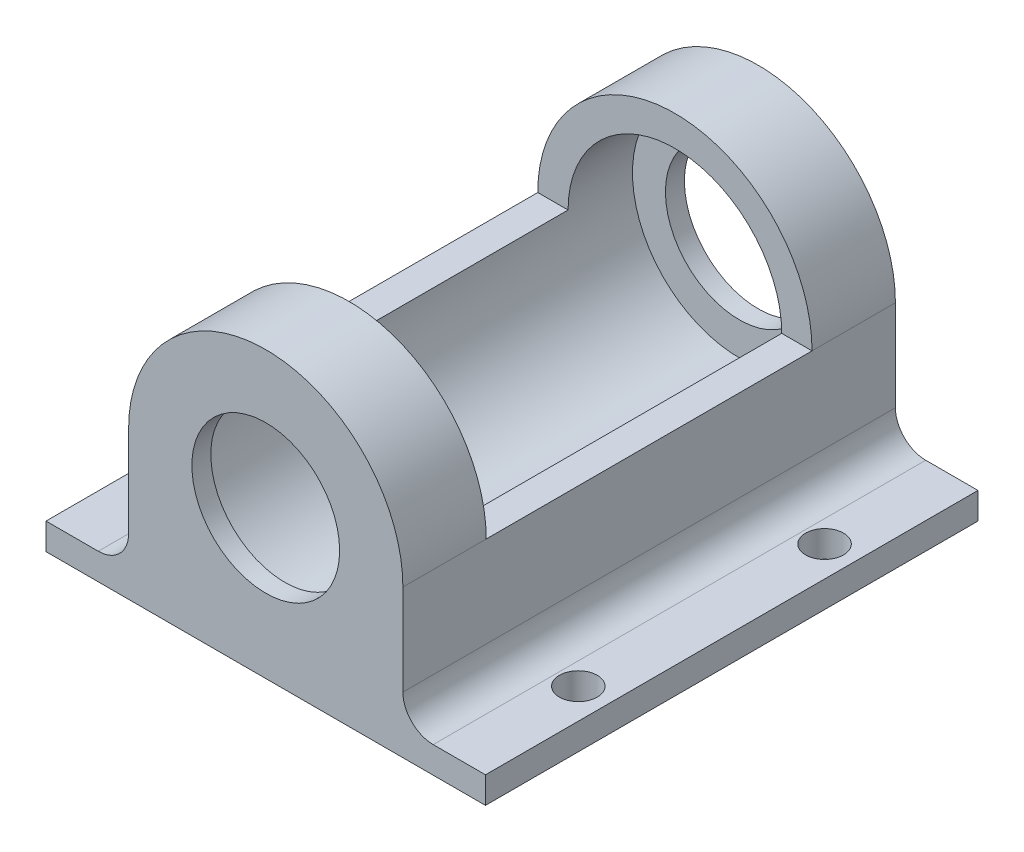
ISO-10303-21;
HEADER;
FILE_DESCRIPTION(('STEP AP214'),'2;1');
FILE_NAME('part.step','',(''),(''),'','','');
FILE_SCHEMA(('AUTOMOTIVE_DESIGN { 1 0 10303 214 1 1 1 1 }'));
ENDSEC;
DATA;
#1=APPLICATION_CONTEXT('core data for automotive mechanical design processes');
#2=APPLICATION_PROTOCOL_DEFINITION('international standard','automotive_design',2000,#1);
#3=PRODUCT_CONTEXT('',#1,'mechanical');
#4=PRODUCT('Part','Part','',(#3));
#5=PRODUCT_RELATED_PRODUCT_CATEGORY('part','',(#4));
#6=PRODUCT_DEFINITION_FORMATION('','',#4);
#7=PRODUCT_DEFINITION_CONTEXT('part definition',#1,'design');
#8=PRODUCT_DEFINITION('design','',#6,#7);
#9=PRODUCT_DEFINITION_SHAPE('','',#8);
#10=(LENGTH_UNIT() NAMED_UNIT(*) SI_UNIT(.MILLI.,.METRE.));
#11=(NAMED_UNIT(*) PLANE_ANGLE_UNIT() SI_UNIT($,.RADIAN.));
#12=(NAMED_UNIT(*) SI_UNIT($,.STERADIAN.) SOLID_ANGLE_UNIT());
#13=UNCERTAINTY_MEASURE_WITH_UNIT(LENGTH_MEASURE(1.E-05),#10,'distance_accuracy_value','');
#14=(GEOMETRIC_REPRESENTATION_CONTEXT(3) GLOBAL_UNCERTAINTY_ASSIGNED_CONTEXT((#13)) GLOBAL_UNIT_ASSIGNED_CONTEXT((#10,
#11,#12)) REPRESENTATION_CONTEXT('',''));
#15=CARTESIAN_POINT('',(0.,0.,0.));
#16=DIRECTION('',(0.,0.,1.));
#17=DIRECTION('',(1.,0.,0.));
#18=AXIS2_PLACEMENT_3D('',#15,#16,#17);
#19=CARTESIAN_POINT('',(0.,3.5,0.));
#20=DIRECTION('',(0.,-1.,0.));
#21=DIRECTION('',(0.,0.,-1.));
#22=AXIS2_PLACEMENT_3D('',#19,#20,#21);
#23=PLANE('',#22);
#24=CARTESIAN_POINT('',(25.,3.5,16.25));
#25=DIRECTION('',(0.,1.,0.));
#26=DIRECTION('',(0.,0.,1.));
#27=AXIS2_PLACEMENT_3D('',#24,#25,#26);
#28=CIRCLE('',#27,2.5);
#29=CARTESIAN_POINT('',(25.,3.5,18.75));
#30=VERTEX_POINT('',#29);
#31=EDGE_CURVE('E282',#30,#30,#28,.T.);
#32=ORIENTED_EDGE('',*,*,#31,.F.);
#33=EDGE_LOOP('',(#32));
#34=FACE_BOUND('',#33,.T.);
#35=CARTESIAN_POINT('',(25.,3.5,-16.25));
#36=DIRECTION('',(0.,1.,0.));
#37=DIRECTION('',(0.,0.,1.));
#38=AXIS2_PLACEMENT_3D('',#35,#36,#37);
#39=CIRCLE('',#38,2.5);
#40=CARTESIAN_POINT('',(25.,3.5,-13.75));
#41=VERTEX_POINT('',#40);
#42=EDGE_CURVE('E274',#41,#41,#39,.T.);
#43=ORIENTED_EDGE('',*,*,#42,.F.);
#44=EDGE_LOOP('',(#43));
#45=FACE_BOUND('',#44,.T.);
#46=DIRECTION('',(0.,0.,-1.));
#47=VECTOR('',#46,1.);
#48=CARTESIAN_POINT('',(22.1,3.5,0.));
#49=LINE('',#48,#47);
#50=CARTESIAN_POINT('',(22.1,3.5,-32.5));
#51=VERTEX_POINT('',#50);
#52=CARTESIAN_POINT('',(22.1,3.5,32.5));
#53=VERTEX_POINT('',#52);
#54=EDGE_CURVE('E355',#51,#53,#49,.F.);
#55=ORIENTED_EDGE('',*,*,#54,.T.);
#56=DIRECTION('',(1.,0.,0.));
#57=VECTOR('',#56,1.);
#58=CARTESIAN_POINT('',(-29.,3.5,32.5));
#59=LINE('',#58,#57);
#60=CARTESIAN_POINT('',(29.,3.5,32.5));
#61=VERTEX_POINT('',#60);
#62=EDGE_CURVE('E311',#53,#61,#59,.T.);
#63=ORIENTED_EDGE('',*,*,#62,.T.);
#64=DIRECTION('',(0.,0.,-1.));
#65=VECTOR('',#64,1.);
#66=CARTESIAN_POINT('',(29.,3.5,32.5));
#67=LINE('',#66,#65);
#68=CARTESIAN_POINT('',(29.,3.5,-32.5));
#69=VERTEX_POINT('',#68);
#70=EDGE_CURVE('E298',#61,#69,#67,.T.);
#71=ORIENTED_EDGE('',*,*,#70,.T.);
#72=DIRECTION('',(-1.,0.,0.));
#73=VECTOR('',#72,1.);
#74=CARTESIAN_POINT('',(-29.,3.5,-32.5));
#75=LINE('',#74,#73);
#76=EDGE_CURVE('E304',#69,#51,#75,.T.);
#77=ORIENTED_EDGE('',*,*,#76,.T.);
#78=EDGE_LOOP('',(#55,#63,#71,#77));
#79=FACE_BOUND('',#78,.T.);
#80=ADVANCED_FACE('F55',(#34,#45,#79),#23,.F.);
#81=CARTESIAN_POINT('',(0.,0.,21.5));
#82=DIRECTION('',(0.,0.,1.));
#83=DIRECTION('',(1.,0.,0.));
#84=AXIS2_PLACEMENT_3D('',#81,#82,#83);
#85=PLANE('',#84);
#86=DIRECTION('',(1.,0.,0.));
#87=VECTOR('',#86,1.);
#88=CARTESIAN_POINT('',(0.,19.5,21.5));
#89=LINE('',#88,#87);
#90=CARTESIAN_POINT('',(14.1,19.5,21.5));
#91=VERTEX_POINT('',#90);
#92=CARTESIAN_POINT('',(18.1,19.5,21.5));
#93=VERTEX_POINT('',#92);
#94=EDGE_CURVE('E76',#91,#93,#89,.T.);
#95=ORIENTED_EDGE('',*,*,#94,.F.);
#96=CARTESIAN_POINT('',(0.,19.5,21.5));
#97=DIRECTION('',(0.,0.,1.));
#98=DIRECTION('',(1.,0.,0.));
#99=AXIS2_PLACEMENT_3D('',#96,#97,#98);
#100=CIRCLE('',#99,14.1);
#101=CARTESIAN_POINT('',(-14.1,19.5,21.5));
#102=VERTEX_POINT('',#101);
#103=EDGE_CURVE('E71',#91,#102,#100,.T.);
#104=ORIENTED_EDGE('',*,*,#103,.T.);
#105=DIRECTION('',(1.,0.,0.));
#106=VECTOR('',#105,1.);
#107=CARTESIAN_POINT('',(0.,19.5,21.5));
#108=LINE('',#107,#106);
#109=CARTESIAN_POINT('',(-18.1,19.5,21.5));
#110=VERTEX_POINT('',#109);
#111=EDGE_CURVE('E210',#110,#102,#108,.T.);
#112=ORIENTED_EDGE('',*,*,#111,.F.);
#113=CARTESIAN_POINT('',(0.,19.5,21.5));
#114=DIRECTION('',(0.,0.,1.));
#115=DIRECTION('',(1.,0.,0.));
#116=AXIS2_PLACEMENT_3D('',#113,#114,#115);
#117=CIRCLE('',#116,18.1);
#118=EDGE_CURVE('E167',#110,#93,#117,.F.);
#119=ORIENTED_EDGE('',*,*,#118,.T.);
#120=EDGE_LOOP('',(#95,#104,#112,#119));
#121=FACE_BOUND('',#120,.T.);
#122=ADVANCED_FACE('F430',(#121),#85,.F.);
#123=CARTESIAN_POINT('',(0.,0.,-21.5));
#124=DIRECTION('',(0.,0.,1.));
#125=DIRECTION('',(1.,0.,0.));
#126=AXIS2_PLACEMENT_3D('',#123,#124,#125);
#127=PLANE('',#126);
#128=CARTESIAN_POINT('',(0.,19.5,-21.5));
#129=DIRECTION('',(0.,0.,1.));
#130=DIRECTION('',(1.,0.,0.));
#131=AXIS2_PLACEMENT_3D('',#128,#129,#130);
#132=CIRCLE('',#131,14.1);
#133=CARTESIAN_POINT('',(14.1,19.5,-21.5));
#134=VERTEX_POINT('',#133);
#135=CARTESIAN_POINT('',(-14.1,19.5,-21.5));
#136=VERTEX_POINT('',#135);
#137=EDGE_CURVE('E179',#134,#136,#132,.T.);
#138=ORIENTED_EDGE('',*,*,#137,.F.);
#139=DIRECTION('',(-1.,0.,0.));
#140=VECTOR('',#139,1.);
#141=CARTESIAN_POINT('',(14.1,19.5,-21.5));
#142=LINE('',#141,#140);
#143=CARTESIAN_POINT('',(18.1,19.5,-21.5));
#144=VERTEX_POINT('',#143);
#145=EDGE_CURVE('E176',#144,#134,#142,.T.);
#146=ORIENTED_EDGE('',*,*,#145,.F.);
#147=CARTESIAN_POINT('',(0.,19.5,-21.5));
#148=DIRECTION('',(0.,0.,1.));
#149=DIRECTION('',(1.,0.,0.));
#150=AXIS2_PLACEMENT_3D('',#147,#148,#149);
#151=CIRCLE('',#150,18.1);
#152=CARTESIAN_POINT('',(-18.1,19.5,-21.5));
#153=VERTEX_POINT('',#152);
#154=EDGE_CURVE('E158',#153,#144,#151,.F.);
#155=ORIENTED_EDGE('',*,*,#154,.F.);
#156=DIRECTION('',(-1.,0.,0.));
#157=VECTOR('',#156,1.);
#158=CARTESIAN_POINT('',(-18.1,19.5,-21.5));
#159=LINE('',#158,#157);
#160=EDGE_CURVE('E173',#136,#153,#159,.T.);
#161=ORIENTED_EDGE('',*,*,#160,.F.);
#162=EDGE_LOOP('',(#138,#146,#155,#161));
#163=FACE_BOUND('',#162,.T.);
#164=ADVANCED_FACE('F171',(#163),#127,.T.);
#165=CARTESIAN_POINT('',(-25.,3.5,-16.25));
#166=DIRECTION('',(0.,1.,0.));
#167=DIRECTION('',(0.,0.,1.));
#168=AXIS2_PLACEMENT_3D('',#165,#166,#167);
#169=CIRCLE('',#168,2.5);
#170=CARTESIAN_POINT('',(-25.,3.5,-13.75));
#171=VERTEX_POINT('',#170);
#172=EDGE_CURVE('E266',#171,#171,#169,.T.);
#173=ORIENTED_EDGE('',*,*,#172,.F.);
#174=EDGE_LOOP('',(#173));
#175=FACE_BOUND('',#174,.T.);
#176=CARTESIAN_POINT('',(-25.,3.5,16.25));
#177=DIRECTION('',(0.,1.,0.));
#178=DIRECTION('',(0.,0.,1.));
#179=AXIS2_PLACEMENT_3D('',#176,#177,#178);
#180=CIRCLE('',#179,2.5);
#181=CARTESIAN_POINT('',(-25.,3.5,18.75));
#182=VERTEX_POINT('',#181);
#183=EDGE_CURVE('E290',#182,#182,#180,.T.);
#184=ORIENTED_EDGE('',*,*,#183,.F.);
#185=EDGE_LOOP('',(#184));
#186=FACE_BOUND('',#185,.T.);
#187=CARTESIAN_POINT('',(-29.,3.5,32.5));
#188=VERTEX_POINT('',#187);
#189=CARTESIAN_POINT('',(-22.1,3.5,32.5));
#190=VERTEX_POINT('',#189);
#191=EDGE_CURVE('E312',#188,#190,#59,.T.);
#192=ORIENTED_EDGE('',*,*,#191,.T.);
#193=DIRECTION('',(0.,0.,-1.));
#194=VECTOR('',#193,1.);
#195=CARTESIAN_POINT('',(-22.1,3.5,-32.5));
#196=LINE('',#195,#194);
#197=CARTESIAN_POINT('',(-22.1,3.5,-32.5));
#198=VERTEX_POINT('',#197);
#199=EDGE_CURVE('E358',#190,#198,#196,.T.);
#200=ORIENTED_EDGE('',*,*,#199,.T.);
#201=CARTESIAN_POINT('',(-29.,3.5,-32.5));
#202=VERTEX_POINT('',#201);
#203=EDGE_CURVE('E302',#198,#202,#75,.T.);
#204=ORIENTED_EDGE('',*,*,#203,.T.);
#205=DIRECTION('',(0.,0.,1.));
#206=VECTOR('',#205,1.);
#207=CARTESIAN_POINT('',(-29.,3.5,32.5));
#208=LINE('',#207,#206);
#209=EDGE_CURVE('E308',#202,#188,#208,.T.);
#210=ORIENTED_EDGE('',*,*,#209,.T.);
#211=EDGE_LOOP('',(#192,#200,#204,#210));
#212=FACE_BOUND('',#211,.T.);
#213=ADVANCED_FACE('F433',(#175,#186,#212),#23,.F.);
#214=CARTESIAN_POINT('',(0.,0.,30.));
#215=DIRECTION('',(0.,0.,1.));
#216=DIRECTION('',(1.,0.,0.));
#217=AXIS2_PLACEMENT_3D('',#214,#215,#216);
#218=PLANE('',#217);
#219=CARTESIAN_POINT('',(0.,19.5,30.));
#220=DIRECTION('',(0.,0.,1.));
#221=DIRECTION('',(1.,0.,0.));
#222=AXIS2_PLACEMENT_3D('',#219,#220,#221);
#223=CIRCLE('',#222,9.75);
#224=CARTESIAN_POINT('',(9.75,19.5,30.));
#225=VERTEX_POINT('',#224);
#226=EDGE_CURVE('E240',#225,#225,#223,.T.);
#227=ORIENTED_EDGE('',*,*,#226,.T.);
#228=EDGE_LOOP('',(#227));
#229=FACE_BOUND('',#228,.T.);
#230=CARTESIAN_POINT('',(0.,19.5,30.));
#231=DIRECTION('',(0.,0.,1.));
#232=DIRECTION('',(1.,0.,0.));
#233=AXIS2_PLACEMENT_3D('',#230,#231,#232);
#234=CIRCLE('',#233,14.1);
#235=CARTESIAN_POINT('',(14.1,19.5,30.));
#236=VERTEX_POINT('',#235);
#237=EDGE_CURVE('E343',#236,#236,#234,.T.);
#238=ORIENTED_EDGE('',*,*,#237,.F.);
#239=EDGE_LOOP('',(#238));
#240=FACE_BOUND('',#239,.T.);
#241=ADVANCED_FACE('F443',(#229,#240),#218,.F.);
#242=CARTESIAN_POINT('',(0.,0.,0.));
#243=DIRECTION('',(0.,-1.,0.));
#244=DIRECTION('',(0.,0.,-1.));
#245=AXIS2_PLACEMENT_3D('',#242,#243,#244);
#246=PLANE('',#245);
#247=CARTESIAN_POINT('',(25.,0.,-16.25));
#248=DIRECTION('',(0.,1.,0.));
#249=DIRECTION('',(0.,0.,1.));
#250=AXIS2_PLACEMENT_3D('',#247,#248,#249);
#251=CIRCLE('',#250,2.5);
#252=CARTESIAN_POINT('',(25.,0.,-13.75));
#253=VERTEX_POINT('',#252);
#254=EDGE_CURVE('E270',#253,#253,#251,.T.);
#255=ORIENTED_EDGE('',*,*,#254,.T.);
#256=EDGE_LOOP('',(#255));
#257=FACE_BOUND('',#256,.T.);
#258=CARTESIAN_POINT('',(-25.,0.,16.25));
#259=DIRECTION('',(0.,1.,0.));
#260=DIRECTION('',(0.,0.,1.));
#261=AXIS2_PLACEMENT_3D('',#258,#259,#260);
#262=CIRCLE('',#261,2.5);
#263=CARTESIAN_POINT('',(-25.,0.,18.75));
#264=VERTEX_POINT('',#263);
#265=EDGE_CURVE('E286',#264,#264,#262,.T.);
#266=ORIENTED_EDGE('',*,*,#265,.T.);
#267=EDGE_LOOP('',(#266));
#268=FACE_BOUND('',#267,.T.);
#269=DIRECTION('',(0.,0.,-1.));
#270=VECTOR('',#269,1.);
#271=CARTESIAN_POINT('',(29.,0.,32.5));
#272=LINE('',#271,#270);
#273=CARTESIAN_POINT('',(29.,0.,32.5));
#274=VERTEX_POINT('',#273);
#275=CARTESIAN_POINT('',(29.,0.,-32.5));
#276=VERTEX_POINT('',#275);
#277=EDGE_CURVE('E294',#274,#276,#272,.T.);
#278=ORIENTED_EDGE('',*,*,#277,.F.);
#279=DIRECTION('',(1.,0.,0.));
#280=VECTOR('',#279,1.);
#281=CARTESIAN_POINT('',(-29.,0.,32.5));
#282=LINE('',#281,#280);
#283=CARTESIAN_POINT('',(-29.,0.,32.5));
#284=VERTEX_POINT('',#283);
#285=EDGE_CURVE('E303',#284,#274,#282,.T.);
#286=ORIENTED_EDGE('',*,*,#285,.F.);
#287=DIRECTION('',(0.,0.,1.));
#288=VECTOR('',#287,1.);
#289=CARTESIAN_POINT('',(-29.,0.,32.5));
#290=LINE('',#289,#288);
#291=CARTESIAN_POINT('',(-29.,0.,-32.5));
#292=VERTEX_POINT('',#291);
#293=EDGE_CURVE('E323',#292,#284,#290,.T.);
#294=ORIENTED_EDGE('',*,*,#293,.F.);
#295=DIRECTION('',(-1.,0.,0.));
#296=VECTOR('',#295,1.);
#297=CARTESIAN_POINT('',(-29.,0.,-32.5));
#298=LINE('',#297,#296);
#299=EDGE_CURVE('E320',#276,#292,#298,.T.);
#300=ORIENTED_EDGE('',*,*,#299,.F.);
#301=EDGE_LOOP('',(#278,#286,#294,#300));
#302=FACE_BOUND('',#301,.T.);
#303=CARTESIAN_POINT('',(25.,0.,16.25));
#304=DIRECTION('',(0.,1.,0.));
#305=DIRECTION('',(0.,0.,1.));
#306=AXIS2_PLACEMENT_3D('',#303,#304,#305);
#307=CIRCLE('',#306,2.5);
#308=CARTESIAN_POINT('',(25.,0.,18.75));
#309=VERTEX_POINT('',#308);
#310=EDGE_CURVE('E278',#309,#309,#307,.T.);
#311=ORIENTED_EDGE('',*,*,#310,.T.);
#312=EDGE_LOOP('',(#311));
#313=FACE_BOUND('',#312,.T.);
#314=CARTESIAN_POINT('',(-25.,0.,-16.25));
#315=DIRECTION('',(0.,1.,0.));
#316=DIRECTION('',(0.,0.,1.));
#317=AXIS2_PLACEMENT_3D('',#314,#315,#316);
#318=CIRCLE('',#317,2.5);
#319=CARTESIAN_POINT('',(-25.,0.,-13.75));
#320=VERTEX_POINT('',#319);
#321=EDGE_CURVE('E263',#320,#320,#318,.T.);
#322=ORIENTED_EDGE('',*,*,#321,.T.);
#323=EDGE_LOOP('',(#322));
#324=FACE_BOUND('',#323,.T.);
#325=ADVANCED_FACE('F426',(#257,#268,#302,#313,#324),#246,.T.);
#326=CARTESIAN_POINT('',(29.,3.5,32.5));
#327=DIRECTION('',(-1.,0.,0.));
#328=DIRECTION('',(0.,0.,1.));
#329=AXIS2_PLACEMENT_3D('',#326,#327,#328);
#330=PLANE('',#329);
#331=ORIENTED_EDGE('',*,*,#277,.T.);
#332=DIRECTION('',(0.,-1.,0.));
#333=VECTOR('',#332,1.);
#334=CARTESIAN_POINT('',(29.,3.5,-32.5));
#335=LINE('',#334,#333);
#336=EDGE_CURVE('E339',#69,#276,#335,.T.);
#337=ORIENTED_EDGE('',*,*,#336,.F.);
#338=ORIENTED_EDGE('',*,*,#70,.F.);
#339=DIRECTION('',(0.,-1.,0.));
#340=VECTOR('',#339,1.);
#341=CARTESIAN_POINT('',(29.,3.5,32.5));
#342=LINE('',#341,#340);
#343=EDGE_CURVE('E316',#61,#274,#342,.T.);
#344=ORIENTED_EDGE('',*,*,#343,.T.);
#345=EDGE_LOOP('',(#331,#337,#338,#344));
#346=FACE_BOUND('',#345,.T.);
#347=ADVANCED_FACE('F418',(#346),#330,.F.);
#348=CARTESIAN_POINT('',(-29.,3.5,-32.5));
#349=DIRECTION('',(0.,0.,1.));
#350=DIRECTION('',(1.,0.,0.));
#351=AXIS2_PLACEMENT_3D('',#348,#349,#350);
#352=PLANE('',#351);
#353=ORIENTED_EDGE('',*,*,#299,.T.);
#354=DIRECTION('',(0.,-1.,0.));
#355=VECTOR('',#354,1.);
#356=CARTESIAN_POINT('',(-29.,3.5,-32.5));
#357=LINE('',#356,#355);
#358=EDGE_CURVE('E335',#202,#292,#357,.T.);
#359=ORIENTED_EDGE('',*,*,#358,.F.);
#360=ORIENTED_EDGE('',*,*,#203,.F.);
#361=CARTESIAN_POINT('',(-22.1,7.5,-32.5));
#362=DIRECTION('',(0.,0.,1.));
#363=DIRECTION('',(1.,0.,0.));
#364=AXIS2_PLACEMENT_3D('',#361,#362,#363);
#365=CIRCLE('',#364,4.);
#366=CARTESIAN_POINT('',(-18.1,7.5,-32.5));
#367=VERTEX_POINT('',#366);
#368=EDGE_CURVE('E369',#198,#367,#365,.T.);
#369=ORIENTED_EDGE('',*,*,#368,.T.);
#370=DIRECTION('',(0.,-1.,0.));
#371=VECTOR('',#370,1.);
#372=CARTESIAN_POINT('',(-18.1,0.,-32.5));
#373=LINE('',#372,#371);
#374=CARTESIAN_POINT('',(-18.1,19.5,-32.5));
#375=VERTEX_POINT('',#374);
#376=EDGE_CURVE('E227',#375,#367,#373,.T.);
#377=ORIENTED_EDGE('',*,*,#376,.F.);
#378=CARTESIAN_POINT('',(0.,19.5,-32.5));
#379=DIRECTION('',(0.,0.,1.));
#380=DIRECTION('',(1.,0.,0.));
#381=AXIS2_PLACEMENT_3D('',#378,#379,#380);
#382=CIRCLE('',#381,18.1);
#383=CARTESIAN_POINT('',(18.1,19.5,-32.5));
#384=VERTEX_POINT('',#383);
#385=EDGE_CURVE('E161',#375,#384,#382,.F.);
#386=ORIENTED_EDGE('',*,*,#385,.T.);
#387=DIRECTION('',(0.,-1.,0.));
#388=VECTOR('',#387,1.);
#389=CARTESIAN_POINT('',(18.1,0.,-32.5));
#390=LINE('',#389,#388);
#391=CARTESIAN_POINT('',(18.1,7.5,-32.5));
#392=VERTEX_POINT('',#391);
#393=EDGE_CURVE('E180',#384,#392,#390,.T.);
#394=ORIENTED_EDGE('',*,*,#393,.T.);
#395=CARTESIAN_POINT('',(22.1,7.5,-32.5));
#396=DIRECTION('',(0.,0.,1.));
#397=DIRECTION('',(1.,0.,0.));
#398=AXIS2_PLACEMENT_3D('',#395,#396,#397);
#399=CIRCLE('',#398,4.);
#400=EDGE_CURVE('E12',#392,#51,#399,.T.);
#401=ORIENTED_EDGE('',*,*,#400,.T.);
#402=ORIENTED_EDGE('',*,*,#76,.F.);
#403=ORIENTED_EDGE('',*,*,#336,.T.);
#404=EDGE_LOOP('',(#353,#359,#360,#369,#377,#386,#394,#401,#402,#403));
#405=FACE_BOUND('',#404,.T.);
#406=CARTESIAN_POINT('',(0.,19.5,-32.5));
#407=DIRECTION('',(0.,0.,1.));
#408=DIRECTION('',(1.,0.,0.));
#409=AXIS2_PLACEMENT_3D('',#406,#407,#408);
#410=CIRCLE('',#409,9.75);
#411=CARTESIAN_POINT('',(-9.75,19.5,-32.5));
#412=VERTEX_POINT('',#411);
#413=EDGE_CURVE('E215',#412,#412,#410,.T.);
#414=ORIENTED_EDGE('',*,*,#413,.T.);
#415=EDGE_LOOP('',(#414));
#416=FACE_BOUND('',#415,.T.);
#417=ADVANCED_FACE('F389',(#405,#416),#352,.F.);
#418=CARTESIAN_POINT('',(-29.,3.5,32.5));
#419=DIRECTION('',(1.,0.,0.));
#420=DIRECTION('',(0.,0.,-1.));
#421=AXIS2_PLACEMENT_3D('',#418,#419,#420);
#422=PLANE('',#421);
#423=ORIENTED_EDGE('',*,*,#293,.T.);
#424=DIRECTION('',(0.,-1.,0.));
#425=VECTOR('',#424,1.);
#426=CARTESIAN_POINT('',(-29.,3.5,32.5));
#427=LINE('',#426,#425);
#428=EDGE_CURVE('E331',#188,#284,#427,.T.);
#429=ORIENTED_EDGE('',*,*,#428,.F.);
#430=ORIENTED_EDGE('',*,*,#209,.F.);
#431=ORIENTED_EDGE('',*,*,#358,.T.);
#432=EDGE_LOOP('',(#423,#429,#430,#431));
#433=FACE_BOUND('',#432,.T.);
#434=ADVANCED_FACE('F417',(#433),#422,.F.);
#435=CARTESIAN_POINT('',(-29.,3.5,32.5));
#436=DIRECTION('',(0.,0.,-1.));
#437=DIRECTION('',(-1.,0.,0.));
#438=AXIS2_PLACEMENT_3D('',#435,#436,#437);
#439=PLANE('',#438);
#440=CARTESIAN_POINT('',(-22.1,7.5,32.5));
#441=DIRECTION('',(0.,0.,-1.));
#442=DIRECTION('',(-1.,0.,0.));
#443=AXIS2_PLACEMENT_3D('',#440,#441,#442);
#444=CIRCLE('',#443,4.);
#445=CARTESIAN_POINT('',(-18.1,7.5,32.5));
#446=VERTEX_POINT('',#445);
#447=EDGE_CURVE('E365',#446,#190,#444,.T.);
#448=ORIENTED_EDGE('',*,*,#447,.T.);
#449=ORIENTED_EDGE('',*,*,#191,.F.);
#450=ORIENTED_EDGE('',*,*,#428,.T.);
#451=ORIENTED_EDGE('',*,*,#285,.T.);
#452=ORIENTED_EDGE('',*,*,#343,.F.);
#453=ORIENTED_EDGE('',*,*,#62,.F.);
#454=CARTESIAN_POINT('',(22.1,7.5,32.5));
#455=DIRECTION('',(0.,0.,-1.));
#456=DIRECTION('',(-1.,0.,0.));
#457=AXIS2_PLACEMENT_3D('',#454,#455,#456);
#458=CIRCLE('',#457,4.);
#459=CARTESIAN_POINT('',(18.1,7.5,32.5));
#460=VERTEX_POINT('',#459);
#461=EDGE_CURVE('E64',#53,#460,#458,.T.);
#462=ORIENTED_EDGE('',*,*,#461,.T.);
#463=DIRECTION('',(0.,-1.,0.));
#464=VECTOR('',#463,1.);
#465=CARTESIAN_POINT('',(18.1,0.,32.5));
#466=LINE('',#465,#464);
#467=CARTESIAN_POINT('',(18.1,19.5,32.5));
#468=VERTEX_POINT('',#467);
#469=EDGE_CURVE('E252',#468,#460,#466,.T.);
#470=ORIENTED_EDGE('',*,*,#469,.F.);
#471=CARTESIAN_POINT('',(0.,19.5,32.5));
#472=DIRECTION('',(0.,0.,1.));
#473=DIRECTION('',(1.,0.,0.));
#474=AXIS2_PLACEMENT_3D('',#471,#472,#473);
#475=CIRCLE('',#474,18.1);
#476=CARTESIAN_POINT('',(-18.1,19.5,32.5));
#477=VERTEX_POINT('',#476);
#478=EDGE_CURVE('E239',#477,#468,#475,.F.);
#479=ORIENTED_EDGE('',*,*,#478,.F.);
#480=DIRECTION('',(0.,-1.,0.));
#481=VECTOR('',#480,1.);
#482=CARTESIAN_POINT('',(-18.1,0.,32.5));
#483=LINE('',#482,#481);
#484=EDGE_CURVE('E248',#477,#446,#483,.T.);
#485=ORIENTED_EDGE('',*,*,#484,.T.);
#486=EDGE_LOOP('',(#448,#449,#450,#451,#452,#453,#462,#470,#479,#485));
#487=FACE_BOUND('',#486,.T.);
#488=CARTESIAN_POINT('',(0.,19.5,32.5));
#489=DIRECTION('',(0.,0.,1.));
#490=DIRECTION('',(1.,0.,0.));
#491=AXIS2_PLACEMENT_3D('',#488,#489,#490);
#492=CIRCLE('',#491,9.75);
#493=CARTESIAN_POINT('',(9.75,19.5,32.5));
#494=VERTEX_POINT('',#493);
#495=EDGE_CURVE('E244',#494,#494,#492,.T.);
#496=ORIENTED_EDGE('',*,*,#495,.F.);
#497=EDGE_LOOP('',(#496));
#498=FACE_BOUND('',#497,.T.);
#499=ADVANCED_FACE('F376',(#487,#498),#439,.F.);
#500=CARTESIAN_POINT('',(-25.,3.5,16.25));
#501=DIRECTION('',(0.,-1.,0.));
#502=DIRECTION('',(0.,0.,-1.));
#503=AXIS2_PLACEMENT_3D('',#500,#501,#502);
#504=CYLINDRICAL_SURFACE('',#503,2.5);
#505=ORIENTED_EDGE('',*,*,#183,.T.);
#506=EDGE_LOOP('',(#505));
#507=FACE_BOUND('',#506,.T.);
#508=ORIENTED_EDGE('',*,*,#265,.F.);
#509=EDGE_LOOP('',(#508));
#510=FACE_BOUND('',#509,.T.);
#511=ADVANCED_FACE('F496',(#507,#510),#504,.F.);
#512=CARTESIAN_POINT('',(25.,3.5,16.25));
#513=DIRECTION('',(0.,-1.,0.));
#514=DIRECTION('',(0.,0.,-1.));
#515=AXIS2_PLACEMENT_3D('',#512,#513,#514);
#516=CYLINDRICAL_SURFACE('',#515,2.5);
#517=ORIENTED_EDGE('',*,*,#31,.T.);
#518=EDGE_LOOP('',(#517));
#519=FACE_BOUND('',#518,.T.);
#520=ORIENTED_EDGE('',*,*,#310,.F.);
#521=EDGE_LOOP('',(#520));
#522=FACE_BOUND('',#521,.T.);
#523=ADVANCED_FACE('F490',(#519,#522),#516,.F.);
#524=CARTESIAN_POINT('',(25.,3.5,-16.25));
#525=DIRECTION('',(0.,-1.,0.));
#526=DIRECTION('',(0.,0.,-1.));
#527=AXIS2_PLACEMENT_3D('',#524,#525,#526);
#528=CYLINDRICAL_SURFACE('',#527,2.5);
#529=ORIENTED_EDGE('',*,*,#42,.T.);
#530=EDGE_LOOP('',(#529));
#531=FACE_BOUND('',#530,.T.);
#532=ORIENTED_EDGE('',*,*,#254,.F.);
#533=EDGE_LOOP('',(#532));
#534=FACE_BOUND('',#533,.T.);
#535=ADVANCED_FACE('F481',(#531,#534),#528,.F.);
#536=CARTESIAN_POINT('',(-25.,3.5,-16.25));
#537=DIRECTION('',(0.,-1.,0.));
#538=DIRECTION('',(0.,0.,-1.));
#539=AXIS2_PLACEMENT_3D('',#536,#537,#538);
#540=CYLINDRICAL_SURFACE('',#539,2.5);
#541=ORIENTED_EDGE('',*,*,#172,.T.);
#542=EDGE_LOOP('',(#541));
#543=FACE_BOUND('',#542,.T.);
#544=ORIENTED_EDGE('',*,*,#321,.F.);
#545=EDGE_LOOP('',(#544));
#546=FACE_BOUND('',#545,.T.);
#547=ADVANCED_FACE('F478',(#543,#546),#540,.F.);
#548=CARTESIAN_POINT('',(0.,19.5,30.));
#549=DIRECTION('',(0.,0.,1.));
#550=DIRECTION('',(1.,0.,0.));
#551=AXIS2_PLACEMENT_3D('',#548,#549,#550);
#552=CYLINDRICAL_SURFACE('',#551,18.1);
#553=ORIENTED_EDGE('',*,*,#478,.T.);
#554=DIRECTION('',(0.,0.,1.));
#555=VECTOR('',#554,1.);
#556=CARTESIAN_POINT('',(18.1,19.5,30.));
#557=LINE('',#556,#555);
#558=EDGE_CURVE('E259',#93,#468,#557,.T.);
#559=ORIENTED_EDGE('',*,*,#558,.F.);
#560=ORIENTED_EDGE('',*,*,#118,.F.);
#561=DIRECTION('',(0.,0.,1.));
#562=VECTOR('',#561,1.);
#563=CARTESIAN_POINT('',(-18.1,19.5,30.));
#564=LINE('',#563,#562);
#565=EDGE_CURVE('E187',#110,#477,#564,.T.);
#566=ORIENTED_EDGE('',*,*,#565,.T.);
#567=EDGE_LOOP('',(#553,#559,#560,#566));
#568=FACE_BOUND('',#567,.T.);
#569=ADVANCED_FACE('F480',(#568),#552,.T.);
#570=CARTESIAN_POINT('',(18.1,0.,30.));
#571=DIRECTION('',(-1.,0.,0.));
#572=DIRECTION('',(0.,0.,1.));
#573=AXIS2_PLACEMENT_3D('',#570,#571,#572);
#574=PLANE('',#573);
#575=ORIENTED_EDGE('',*,*,#469,.T.);
#576=DIRECTION('',(0.,0.,1.));
#577=VECTOR('',#576,1.);
#578=CARTESIAN_POINT('',(18.1,7.5,21.5));
#579=LINE('',#578,#577);
#580=EDGE_CURVE('E362',#460,#392,#579,.F.);
#581=ORIENTED_EDGE('',*,*,#580,.T.);
#582=ORIENTED_EDGE('',*,*,#393,.F.);
#583=DIRECTION('',(0.,0.,-1.));
#584=VECTOR('',#583,1.);
#585=CARTESIAN_POINT('',(18.1,19.5,-21.5));
#586=LINE('',#585,#584);
#587=EDGE_CURVE('E168',#144,#384,#586,.T.);
#588=ORIENTED_EDGE('',*,*,#587,.F.);
#589=DIRECTION('',(0.,0.,-1.));
#590=VECTOR('',#589,1.);
#591=CARTESIAN_POINT('',(18.1,19.5,32.5));
#592=LINE('',#591,#590);
#593=EDGE_CURVE('E207',#93,#144,#592,.T.);
#594=ORIENTED_EDGE('',*,*,#593,.F.);
#595=ORIENTED_EDGE('',*,*,#558,.T.);
#596=EDGE_LOOP('',(#575,#581,#582,#588,#594,#595));
#597=FACE_BOUND('',#596,.T.);
#598=ADVANCED_FACE('F384',(#597),#574,.F.);
#599=CARTESIAN_POINT('',(-18.1,0.,30.));
#600=DIRECTION('',(-1.,0.,0.));
#601=DIRECTION('',(0.,-1.,0.));
#602=AXIS2_PLACEMENT_3D('',#599,#600,#601);
#603=PLANE('',#602);
#604=ORIENTED_EDGE('',*,*,#565,.F.);
#605=DIRECTION('',(0.,0.,-1.));
#606=VECTOR('',#605,1.);
#607=CARTESIAN_POINT('',(-18.1,19.5,32.5));
#608=LINE('',#607,#606);
#609=EDGE_CURVE('E184',#110,#153,#608,.T.);
#610=ORIENTED_EDGE('',*,*,#609,.T.);
#611=DIRECTION('',(0.,0.,-1.));
#612=VECTOR('',#611,1.);
#613=CARTESIAN_POINT('',(-18.1,19.5,-21.5));
#614=LINE('',#613,#612);
#615=EDGE_CURVE('E155',#153,#375,#614,.T.);
#616=ORIENTED_EDGE('',*,*,#615,.T.);
#617=ORIENTED_EDGE('',*,*,#376,.T.);
#618=DIRECTION('',(0.,0.,1.));
#619=VECTOR('',#618,1.);
#620=CARTESIAN_POINT('',(-18.1,7.5,30.));
#621=LINE('',#620,#619);
#622=EDGE_CURVE('E351',#367,#446,#621,.T.);
#623=ORIENTED_EDGE('',*,*,#622,.T.);
#624=ORIENTED_EDGE('',*,*,#484,.F.);
#625=EDGE_LOOP('',(#604,#610,#616,#617,#623,#624));
#626=FACE_BOUND('',#625,.T.);
#627=ADVANCED_FACE('F185',(#626),#603,.T.);
#628=CARTESIAN_POINT('',(0.,19.5,30.));
#629=DIRECTION('',(0.,0.,1.));
#630=DIRECTION('',(1.,0.,0.));
#631=AXIS2_PLACEMENT_3D('',#628,#629,#630);
#632=CYLINDRICAL_SURFACE('',#631,9.75);
#633=ORIENTED_EDGE('',*,*,#226,.F.);
#634=EDGE_LOOP('',(#633));
#635=FACE_BOUND('',#634,.T.);
#636=ORIENTED_EDGE('',*,*,#495,.T.);
#637=EDGE_LOOP('',(#636));
#638=FACE_BOUND('',#637,.T.);
#639=ADVANCED_FACE('F398',(#635,#638),#632,.F.);
#640=CARTESIAN_POINT('',(0.,19.5,21.5));
#641=DIRECTION('',(0.,0.,1.));
#642=DIRECTION('',(1.,0.,0.));
#643=AXIS2_PLACEMENT_3D('',#640,#641,#642);
#644=CYLINDRICAL_SURFACE('',#643,14.1);
#645=ORIENTED_EDGE('',*,*,#103,.F.);
#646=DIRECTION('',(0.,0.,-1.));
#647=VECTOR('',#646,1.);
#648=CARTESIAN_POINT('',(14.1,19.5,32.5));
#649=LINE('',#648,#647);
#650=EDGE_CURVE('E203',#91,#134,#649,.T.);
#651=ORIENTED_EDGE('',*,*,#650,.T.);
#652=ORIENTED_EDGE('',*,*,#137,.T.);
#653=DIRECTION('',(0.,0.,-1.));
#654=VECTOR('',#653,1.);
#655=CARTESIAN_POINT('',(-14.1,19.5,32.5));
#656=LINE('',#655,#654);
#657=EDGE_CURVE('E191',#102,#136,#656,.T.);
#658=ORIENTED_EDGE('',*,*,#657,.F.);
#659=EDGE_LOOP('',(#645,#651,#652,#658));
#660=FACE_BOUND('',#659,.T.);
#661=ORIENTED_EDGE('',*,*,#237,.T.);
#662=EDGE_LOOP('',(#661));
#663=FACE_BOUND('',#662,.T.);
#664=CARTESIAN_POINT('',(0.,19.5,-30.));
#665=DIRECTION('',(0.,0.,1.));
#666=DIRECTION('',(1.,0.,0.));
#667=AXIS2_PLACEMENT_3D('',#664,#665,#666);
#668=CIRCLE('',#667,14.1);
#669=CARTESIAN_POINT('',(14.1,19.5,-30.));
#670=VERTEX_POINT('',#669);
#671=EDGE_CURVE('E347',#670,#670,#668,.T.);
#672=ORIENTED_EDGE('',*,*,#671,.F.);
#673=EDGE_LOOP('',(#672));
#674=FACE_BOUND('',#673,.T.);
#675=ADVANCED_FACE('F395',(#660,#663,#674),#644,.F.);
#676=CARTESIAN_POINT('',(0.,19.5,-21.5));
#677=DIRECTION('',(0.,0.,-1.));
#678=DIRECTION('',(-1.,0.,0.));
#679=AXIS2_PLACEMENT_3D('',#676,#677,#678);
#680=CYLINDRICAL_SURFACE('',#679,18.1);
#681=ORIENTED_EDGE('',*,*,#385,.F.);
#682=ORIENTED_EDGE('',*,*,#615,.F.);
#683=ORIENTED_EDGE('',*,*,#154,.T.);
#684=ORIENTED_EDGE('',*,*,#587,.T.);
#685=EDGE_LOOP('',(#681,#682,#683,#684));
#686=FACE_BOUND('',#685,.T.);
#687=ADVANCED_FACE('F157',(#686),#680,.T.);
#688=CARTESIAN_POINT('',(0.,19.5,-30.));
#689=DIRECTION('',(0.,0.,1.));
#690=DIRECTION('',(1.,0.,0.));
#691=AXIS2_PLACEMENT_3D('',#688,#689,#690);
#692=PLANE('',#691);
#693=ORIENTED_EDGE('',*,*,#671,.T.);
#694=EDGE_LOOP('',(#693));
#695=FACE_BOUND('',#694,.T.);
#696=CARTESIAN_POINT('',(0.,19.5,-30.));
#697=DIRECTION('',(0.,0.,1.));
#698=DIRECTION('',(1.,0.,0.));
#699=AXIS2_PLACEMENT_3D('',#696,#697,#698);
#700=CIRCLE('',#699,9.75);
#701=CARTESIAN_POINT('',(-9.75,19.5,-30.));
#702=VERTEX_POINT('',#701);
#703=EDGE_CURVE('E216',#702,#702,#700,.T.);
#704=ORIENTED_EDGE('',*,*,#703,.F.);
#705=EDGE_LOOP('',(#704));
#706=FACE_BOUND('',#705,.T.);
#707=ADVANCED_FACE('F404',(#695,#706),#692,.T.);
#708=CARTESIAN_POINT('',(0.,19.5,-30.));
#709=DIRECTION('',(0.,0.,-1.));
#710=DIRECTION('',(-1.,0.,0.));
#711=AXIS2_PLACEMENT_3D('',#708,#709,#710);
#712=CYLINDRICAL_SURFACE('',#711,9.75);
#713=CARTESIAN_POINT('',(-9.75,19.5,-30.));
#714=CARTESIAN_POINT('',(-9.75,19.5,-30.0260416666667));
#715=CARTESIAN_POINT('',(-9.75,19.5,-30.0520833333333));
#716=CARTESIAN_POINT('',(-9.75,19.5,-30.1041666666667));
#717=CARTESIAN_POINT('',(-9.75,19.5,-30.1302083333333));
#718=CARTESIAN_POINT('',(-9.75,19.5,-30.1822916666667));
#719=CARTESIAN_POINT('',(-9.75,19.5,-30.2083333333333));
#720=CARTESIAN_POINT('',(-9.75,19.5,-30.2604166666667));
#721=CARTESIAN_POINT('',(-9.75,19.5,-30.2864583333333));
#722=CARTESIAN_POINT('',(-9.75,19.5,-30.3385416666667));
#723=CARTESIAN_POINT('',(-9.75,19.5,-30.3645833333333));
#724=CARTESIAN_POINT('',(-9.75,19.5,-30.4166666666667));
#725=CARTESIAN_POINT('',(-9.75,19.5,-30.4427083333333));
#726=CARTESIAN_POINT('',(-9.75,19.5,-30.4947916666667));
#727=CARTESIAN_POINT('',(-9.75,19.5,-30.5208333333333));
#728=CARTESIAN_POINT('',(-9.75,19.5,-30.5729166666667));
#729=CARTESIAN_POINT('',(-9.75,19.5,-30.5989583333333));
#730=CARTESIAN_POINT('',(-9.75,19.5,-30.6510416666667));
#731=CARTESIAN_POINT('',(-9.75,19.5,-30.6770833333333));
#732=CARTESIAN_POINT('',(-9.75,19.5,-30.7291666666667));
#733=CARTESIAN_POINT('',(-9.75,19.5,-30.7552083333333));
#734=CARTESIAN_POINT('',(-9.75,19.5,-30.8072916666667));
#735=CARTESIAN_POINT('',(-9.75,19.5,-30.8333333333333));
#736=CARTESIAN_POINT('',(-9.75,19.5,-30.8854166666667));
#737=CARTESIAN_POINT('',(-9.75,19.5,-30.9114583333333));
#738=CARTESIAN_POINT('',(-9.75,19.5,-30.9635416666667));
#739=CARTESIAN_POINT('',(-9.75,19.5,-30.9895833333333));
#740=CARTESIAN_POINT('',(-9.75,19.5,-31.0416666666667));
#741=CARTESIAN_POINT('',(-9.75,19.5,-31.0677083333333));
#742=CARTESIAN_POINT('',(-9.75,19.5,-31.1197916666667));
#743=CARTESIAN_POINT('',(-9.75,19.5,-31.1458333333333));
#744=CARTESIAN_POINT('',(-9.75,19.5,-31.1979166666667));
#745=CARTESIAN_POINT('',(-9.75,19.5,-31.2239583333333));
#746=CARTESIAN_POINT('',(-9.75,19.5,-31.2760416666667));
#747=CARTESIAN_POINT('',(-9.75,19.5,-31.3020833333333));
#748=CARTESIAN_POINT('',(-9.75,19.5,-31.3541666666667));
#749=CARTESIAN_POINT('',(-9.75,19.5,-31.3802083333333));
#750=CARTESIAN_POINT('',(-9.75,19.5,-31.4322916666667));
#751=CARTESIAN_POINT('',(-9.75,19.5,-31.4583333333333));
#752=CARTESIAN_POINT('',(-9.75,19.5,-31.5104166666667));
#753=CARTESIAN_POINT('',(-9.75,19.5,-31.5364583333333));
#754=CARTESIAN_POINT('',(-9.75,19.5,-31.5885416666667));
#755=CARTESIAN_POINT('',(-9.75,19.5,-31.6145833333333));
#756=CARTESIAN_POINT('',(-9.75,19.5,-31.6666666666667));
#757=CARTESIAN_POINT('',(-9.75,19.5,-31.6927083333333));
#758=CARTESIAN_POINT('',(-9.75,19.5,-31.7447916666667));
#759=CARTESIAN_POINT('',(-9.75,19.5,-31.7708333333333));
#760=CARTESIAN_POINT('',(-9.75,19.5,-31.8229166666667));
#761=CARTESIAN_POINT('',(-9.75,19.5,-31.8489583333333));
#762=CARTESIAN_POINT('',(-9.75,19.5,-31.9010416666667));
#763=CARTESIAN_POINT('',(-9.75,19.5,-31.9270833333333));
#764=CARTESIAN_POINT('',(-9.75,19.5,-31.9791666666667));
#765=CARTESIAN_POINT('',(-9.75,19.5,-32.0052083333333));
#766=CARTESIAN_POINT('',(-9.75,19.5,-32.0572916666667));
#767=CARTESIAN_POINT('',(-9.75,19.5,-32.0833333333333));
#768=CARTESIAN_POINT('',(-9.75,19.5,-32.1354166666667));
#769=CARTESIAN_POINT('',(-9.75,19.5,-32.1614583333333));
#770=CARTESIAN_POINT('',(-9.75,19.5,-32.2135416666667));
#771=CARTESIAN_POINT('',(-9.75,19.5,-32.2395833333333));
#772=CARTESIAN_POINT('',(-9.75,19.5,-32.2916666666667));
#773=CARTESIAN_POINT('',(-9.75,19.5,-32.3177083333333));
#774=CARTESIAN_POINT('',(-9.75,19.5,-32.3697916666667));
#775=CARTESIAN_POINT('',(-9.75,19.5,-32.3958333333333));
#776=CARTESIAN_POINT('',(-9.75,19.5,-32.4479166666667));
#777=CARTESIAN_POINT('',(-9.75,19.5,-32.4739583333333));
#778=CARTESIAN_POINT('',(-9.75,19.5,-32.5));
#779=B_SPLINE_CURVE_WITH_KNOTS('',3,(#713,#714,#715,#716,#717,#718,#719,#720,#721,#722,#723,
#724,#725,#726,#727,#728,#729,#730,#731,#732,#733,#734,#735,#736,#737,#738,#739,#740,#741,#742,
#743,#744,#745,#746,#747,#748,#749,#750,#751,#752,#753,#754,#755,#756,#757,#758,#759,#760,#761,
#762,#763,#764,#765,#766,#767,#768,#769,#770,#771,#772,#773,#774,#775,#776,#777,#778),
.UNSPECIFIED.,.F.,.F.,(4,2,2,2,2,2,2,2,2,2,2,2,2,2,2,2,2,2,2,2,2,2,2,2,2,2,2,2,2,2,2,2,4),(0.,
0.0781249999999983,0.156249999999997,0.234374999999998,0.312499999999997,0.390624999999999,
0.468749999999997,0.546874999999999,0.624999999999997,0.703124999999999,0.781249999999997,
0.859374999999999,0.937499999999997,1.015625,1.09375,1.171875,1.25,1.328125,1.40625,1.484375,
1.5625,1.640625,1.71875,1.796875,1.875,1.953125,2.03125,2.109375,2.1875,2.265625,2.34375,
2.421875,2.5),.UNSPECIFIED.);
#780=EDGE_CURVE('BSEAM407',#702,#412,#779,.T.);
#781=ORIENTED_EDGE('',*,*,#703,.T.);
#782=ORIENTED_EDGE('',*,*,#413,.F.);
#783=ORIENTED_EDGE('',*,*,#780,.T.);
#784=ORIENTED_EDGE('',*,*,#780,.F.);
#785=EDGE_LOOP('',(#781,#783,#782,#784));
#786=FACE_BOUND('',#785,.T.);
#787=ADVANCED_FACE('F407',(#786),#712,.F.);
#788=CARTESIAN_POINT('',(-22.1,7.5,30.));
#789=DIRECTION('',(0.,0.,1.));
#790=DIRECTION('',(1.,0.,0.));
#791=AXIS2_PLACEMENT_3D('',#788,#789,#790);
#792=CYLINDRICAL_SURFACE('',#791,4.);
#793=ORIENTED_EDGE('',*,*,#622,.F.);
#794=ORIENTED_EDGE('',*,*,#368,.F.);
#795=ORIENTED_EDGE('',*,*,#199,.F.);
#796=ORIENTED_EDGE('',*,*,#447,.F.);
#797=EDGE_LOOP('',(#793,#794,#795,#796));
#798=FACE_BOUND('',#797,.T.);
#799=ADVANCED_FACE('F413',(#798),#792,.F.);
#800=CARTESIAN_POINT('',(22.1,7.5,0.));
#801=DIRECTION('',(0.,0.,-1.));
#802=DIRECTION('',(-1.,0.,0.));
#803=AXIS2_PLACEMENT_3D('',#800,#801,#802);
#804=CYLINDRICAL_SURFACE('',#803,4.);
#805=ORIENTED_EDGE('',*,*,#461,.F.);
#806=ORIENTED_EDGE('',*,*,#54,.F.);
#807=ORIENTED_EDGE('',*,*,#400,.F.);
#808=ORIENTED_EDGE('',*,*,#580,.F.);
#809=EDGE_LOOP('',(#805,#806,#807,#808));
#810=FACE_BOUND('',#809,.T.);
#811=ADVANCED_FACE('F57',(#810),#804,.F.);
#812=CARTESIAN_POINT('',(14.1,19.5,32.5));
#813=DIRECTION('',(0.,-1.,0.));
#814=DIRECTION('',(1.,0.,0.));
#815=AXIS2_PLACEMENT_3D('',#812,#813,#814);
#816=PLANE('',#815);
#817=ORIENTED_EDGE('',*,*,#650,.F.);
#818=ORIENTED_EDGE('',*,*,#94,.T.);
#819=ORIENTED_EDGE('',*,*,#593,.T.);
#820=ORIENTED_EDGE('',*,*,#145,.T.);
#821=EDGE_LOOP('',(#817,#818,#819,#820));
#822=FACE_BOUND('',#821,.T.);
#823=ADVANCED_FACE('F393',(#822),#816,.F.);
#824=CARTESIAN_POINT('',(-18.1,19.5,32.5));
#825=DIRECTION('',(0.,-1.,0.));
#826=DIRECTION('',(1.,0.,0.));
#827=AXIS2_PLACEMENT_3D('',#824,#825,#826);
#828=PLANE('',#827);
#829=ORIENTED_EDGE('',*,*,#609,.F.);
#830=ORIENTED_EDGE('',*,*,#111,.T.);
#831=ORIENTED_EDGE('',*,*,#657,.T.);
#832=ORIENTED_EDGE('',*,*,#160,.T.);
#833=EDGE_LOOP('',(#829,#830,#831,#832));
#834=FACE_BOUND('',#833,.T.);
#835=ADVANCED_FACE('F194',(#834),#828,.F.);
#836=CLOSED_SHELL('',(#80,#122,#164,#213,#241,#325,#347,#417,#434,#499,#511,#523,#535,#547,#569,
#598,#627,#639,#675,#687,#707,#787,#799,#811,#823,#835));
#837=MANIFOLD_SOLID_BREP('B2',#836);
#838=ADVANCED_BREP_SHAPE_REPRESENTATION('',(#18,#837),#14);
#839=SHAPE_DEFINITION_REPRESENTATION(#9,#838);
ENDSEC;
END-ISO-10303-21;
